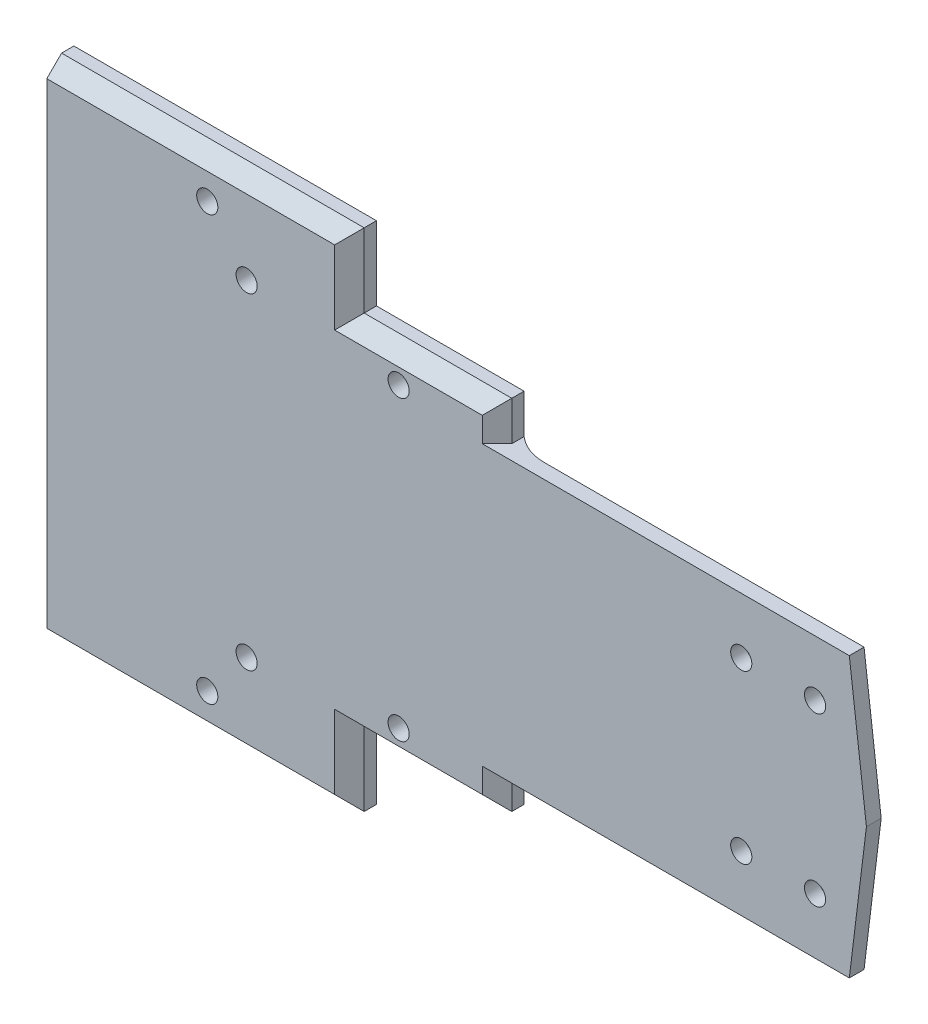
ISO-10303-21;
HEADER;
FILE_DESCRIPTION(('STEP AP214'),'2;1');
FILE_NAME('part.step','',(''),(''),'','','');
FILE_SCHEMA(('AUTOMOTIVE_DESIGN { 1 0 10303 214 1 1 1 1 }'));
ENDSEC;
DATA;
#1=APPLICATION_CONTEXT('core data for automotive mechanical design processes');
#2=APPLICATION_PROTOCOL_DEFINITION('international standard','automotive_design',2000,#1);
#3=PRODUCT_CONTEXT('',#1,'mechanical');
#4=PRODUCT('Part','Part','',(#3));
#5=PRODUCT_RELATED_PRODUCT_CATEGORY('part','',(#4));
#6=PRODUCT_DEFINITION_FORMATION('','',#4);
#7=PRODUCT_DEFINITION_CONTEXT('part definition',#1,'design');
#8=PRODUCT_DEFINITION('design','',#6,#7);
#9=PRODUCT_DEFINITION_SHAPE('','',#8);
#10=(LENGTH_UNIT() NAMED_UNIT(*) SI_UNIT(.MILLI.,.METRE.));
#11=(NAMED_UNIT(*) PLANE_ANGLE_UNIT() SI_UNIT($,.RADIAN.));
#12=(NAMED_UNIT(*) SI_UNIT($,.STERADIAN.) SOLID_ANGLE_UNIT());
#13=UNCERTAINTY_MEASURE_WITH_UNIT(LENGTH_MEASURE(1.E-05),#10,'distance_accuracy_value','');
#14=(GEOMETRIC_REPRESENTATION_CONTEXT(3) GLOBAL_UNCERTAINTY_ASSIGNED_CONTEXT((#13)) GLOBAL_UNIT_ASSIGNED_CONTEXT((#10,
#11,#12)) REPRESENTATION_CONTEXT('',''));
#15=CARTESIAN_POINT('',(0.,0.,0.));
#16=DIRECTION('',(0.,0.,1.));
#17=DIRECTION('',(1.,0.,0.));
#18=AXIS2_PLACEMENT_3D('',#15,#16,#17);
#19=CARTESIAN_POINT('',(-3.82500000000006,0.,-2.5));
#20=DIRECTION('',(-1.,0.,0.));
#21=DIRECTION('',(0.,-1.,0.));
#22=AXIS2_PLACEMENT_3D('',#19,#20,#21);
#23=PLANE('',#22);
#24=DIRECTION('',(0.,0.,1.));
#25=VECTOR('',#24,1.);
#26=CARTESIAN_POINT('',(-3.82500000000005,-28.37,3.));
#27=LINE('',#26,#25);
#28=CARTESIAN_POINT('',(-3.82500000000005,-28.37,-2.5));
#29=VERTEX_POINT('',#28);
#30=CARTESIAN_POINT('',(-3.82500000000005,-28.37,0.));
#31=VERTEX_POINT('',#30);
#32=EDGE_CURVE('E287',#29,#31,#27,.T.);
#33=ORIENTED_EDGE('',*,*,#32,.T.);
#34=DIRECTION('',(0.,-1.,0.));
#35=VECTOR('',#34,1.);
#36=CARTESIAN_POINT('',(-3.82500000000005,-36.37,0.));
#37=LINE('',#36,#35);
#38=CARTESIAN_POINT('',(-3.82500000000005,-36.37,0.));
#39=VERTEX_POINT('',#38);
#40=EDGE_CURVE('E329',#31,#39,#37,.T.);
#41=ORIENTED_EDGE('',*,*,#40,.T.);
#42=DIRECTION('',(0.,0.,1.));
#43=VECTOR('',#42,1.);
#44=CARTESIAN_POINT('',(-3.82500000000005,-36.37,-2.5));
#45=LINE('',#44,#43);
#46=CARTESIAN_POINT('',(-3.82500000000005,-36.37,-2.5));
#47=VERTEX_POINT('',#46);
#48=EDGE_CURVE('E257',#47,#39,#45,.T.);
#49=ORIENTED_EDGE('',*,*,#48,.F.);
#50=DIRECTION('',(0.,-1.,0.));
#51=VECTOR('',#50,1.);
#52=CARTESIAN_POINT('',(-3.82500000000006,0.,-2.5));
#53=LINE('',#52,#51);
#54=EDGE_CURVE('E247',#29,#47,#53,.T.);
#55=ORIENTED_EDGE('',*,*,#54,.F.);
#56=EDGE_LOOP('',(#33,#41,#49,#55));
#57=FACE_BOUND('',#56,.T.);
#58=ADVANCED_FACE('F38',(#57),#23,.F.);
#59=CARTESIAN_POINT('',(-71.2500000000001,28.37,3.));
#60=DIRECTION('',(0.,-1.,0.));
#61=DIRECTION('',(0.,0.,-1.));
#62=AXIS2_PLACEMENT_3D('',#59,#60,#61);
#63=PLANE('',#62);
#64=DIRECTION('',(0.,0.,-1.));
#65=VECTOR('',#64,1.);
#66=CARTESIAN_POINT('',(-3.82500000000005,28.37,3.));
#67=LINE('',#66,#65);
#68=CARTESIAN_POINT('',(-3.82500000000005,28.37,0.));
#69=VERTEX_POINT('',#68);
#70=CARTESIAN_POINT('',(-3.82500000000006,28.37,-2.5));
#71=VERTEX_POINT('',#70);
#72=EDGE_CURVE('E259',#69,#71,#67,.T.);
#73=ORIENTED_EDGE('',*,*,#72,.F.);
#74=DIRECTION('',(-0.707106781186544,0.,0.707106781186551));
#75=VECTOR('',#74,1.);
#76=CARTESIAN_POINT('',(-39.0374999999998,28.37,35.2125));
#77=LINE('',#76,#75);
#78=CARTESIAN_POINT('',(-6.82500000000007,28.37,3.));
#79=VERTEX_POINT('',#78);
#80=EDGE_CURVE('E48',#69,#79,#77,.T.);
#81=ORIENTED_EDGE('',*,*,#80,.T.);
#82=DIRECTION('',(-1.,0.,0.));
#83=VECTOR('',#82,1.);
#84=CARTESIAN_POINT('',(-71.2500000000001,28.37,3.));
#85=LINE('',#84,#83);
#86=CARTESIAN_POINT('',(67.7716280476557,28.37,3.));
#87=VERTEX_POINT('',#86);
#88=EDGE_CURVE('E282',#87,#79,#85,.T.);
#89=ORIENTED_EDGE('',*,*,#88,.F.);
#90=DIRECTION('',(0.,0.,1.));
#91=VECTOR('',#90,1.);
#92=CARTESIAN_POINT('',(67.7716280476557,28.37,0.));
#93=LINE('',#92,#91);
#94=CARTESIAN_POINT('',(67.7716280476557,28.37,0.));
#95=VERTEX_POINT('',#94);
#96=EDGE_CURVE('E278',#95,#87,#93,.T.);
#97=ORIENTED_EDGE('',*,*,#96,.F.);
#98=DIRECTION('',(-1.,0.,0.));
#99=VECTOR('',#98,1.);
#100=CARTESIAN_POINT('',(-71.2500000000001,28.37,0.));
#101=LINE('',#100,#99);
#102=CARTESIAN_POINT('',(2.78937827766142,28.37,0.));
#103=VERTEX_POINT('',#102);
#104=EDGE_CURVE('E280',#95,#103,#101,.T.);
#105=ORIENTED_EDGE('',*,*,#104,.T.);
#106=CARTESIAN_POINT('',(2.78937827766141,28.37,-10.));
#107=DIRECTION('',(0.,-1.,0.));
#108=DIRECTION('',(0.,0.,-1.));
#109=AXIS2_PLACEMENT_3D('',#106,#107,#108);
#110=CIRCLE('',#109,10.);
#111=EDGE_CURVE('E297',#103,#71,#110,.T.);
#112=ORIENTED_EDGE('',*,*,#111,.T.);
#113=EDGE_LOOP('',(#73,#81,#89,#97,#105,#112));
#114=FACE_BOUND('',#113,.T.);
#115=ADVANCED_FACE('F410',(#114),#63,.F.);
#116=CARTESIAN_POINT('',(0.,0.,0.));
#117=DIRECTION('',(0.,0.,1.));
#118=DIRECTION('',(1.,0.,0.));
#119=AXIS2_PLACEMENT_3D('',#116,#117,#118);
#120=PLANE('',#119);
#121=CARTESIAN_POINT('',(60.8080278919349,-17.,0.));
#122=DIRECTION('',(0.,0.,1.));
#123=DIRECTION('',(1.,0.,0.));
#124=AXIS2_PLACEMENT_3D('',#121,#122,#123);
#125=CIRCLE('',#124,2.15);
#126=CARTESIAN_POINT('',(62.9580278919349,-17.,0.));
#127=VERTEX_POINT('',#126);
#128=EDGE_CURVE('E244',#127,#127,#125,.T.);
#129=ORIENTED_EDGE('',*,*,#128,.T.);
#130=EDGE_LOOP('',(#129));
#131=FACE_BOUND('',#130,.T.);
#132=CARTESIAN_POINT('',(45.8080278919349,17.,0.));
#133=DIRECTION('',(0.,0.,1.));
#134=DIRECTION('',(1.,0.,0.));
#135=AXIS2_PLACEMENT_3D('',#132,#133,#134);
#136=CIRCLE('',#135,2.15);
#137=CARTESIAN_POINT('',(47.9580278919349,17.,0.));
#138=VERTEX_POINT('',#137);
#139=EDGE_CURVE('E241',#138,#138,#136,.T.);
#140=ORIENTED_EDGE('',*,*,#139,.T.);
#141=EDGE_LOOP('',(#140));
#142=FACE_BOUND('',#141,.T.);
#143=CARTESIAN_POINT('',(45.8080278919349,-17.,0.));
#144=DIRECTION('',(0.,0.,1.));
#145=DIRECTION('',(1.,0.,0.));
#146=AXIS2_PLACEMENT_3D('',#143,#144,#145);
#147=CIRCLE('',#146,2.15);
#148=CARTESIAN_POINT('',(47.9580278919349,-17.,0.));
#149=VERTEX_POINT('',#148);
#150=EDGE_CURVE('E238',#149,#149,#147,.T.);
#151=ORIENTED_EDGE('',*,*,#150,.T.);
#152=EDGE_LOOP('',(#151));
#153=FACE_BOUND('',#152,.T.);
#154=CARTESIAN_POINT('',(60.8080278919349,17.,0.));
#155=DIRECTION('',(0.,0.,1.));
#156=DIRECTION('',(1.,0.,0.));
#157=AXIS2_PLACEMENT_3D('',#154,#155,#156);
#158=CIRCLE('',#157,2.15);
#159=CARTESIAN_POINT('',(62.9580278919349,17.,0.));
#160=VERTEX_POINT('',#159);
#161=EDGE_CURVE('E235',#160,#160,#158,.T.);
#162=ORIENTED_EDGE('',*,*,#161,.T.);
#163=EDGE_LOOP('',(#162));
#164=FACE_BOUND('',#163,.T.);
#165=DIRECTION('',(1.,0.,0.));
#166=VECTOR('',#165,1.);
#167=CARTESIAN_POINT('',(-71.2500000000001,-28.37,0.));
#168=LINE('',#167,#166);
#169=CARTESIAN_POINT('',(2.78937827766143,-28.37,0.));
#170=VERTEX_POINT('',#169);
#171=CARTESIAN_POINT('',(67.7716280476557,-28.37,0.));
#172=VERTEX_POINT('',#171);
#173=EDGE_CURVE('E285',#170,#172,#168,.T.);
#174=ORIENTED_EDGE('',*,*,#173,.F.);
#175=DIRECTION('',(0.,1.,0.));
#176=VECTOR('',#175,1.);
#177=CARTESIAN_POINT('',(2.78937827766142,0.,0.));
#178=LINE('',#177,#176);
#179=EDGE_CURVE('E293',#170,#103,#178,.T.);
#180=ORIENTED_EDGE('',*,*,#179,.T.);
#181=ORIENTED_EDGE('',*,*,#104,.F.);
#182=DIRECTION('',(-0.121696109566606,0.992567406736869,0.));
#183=VECTOR('',#182,1.);
#184=CARTESIAN_POINT('',(70.1947915552901,8.60640092162754,0.));
#185=LINE('',#184,#183);
#186=CARTESIAN_POINT('',(71.25,0.,0.));
#187=VERTEX_POINT('',#186);
#188=EDGE_CURVE('E273',#187,#95,#185,.T.);
#189=ORIENTED_EDGE('',*,*,#188,.F.);
#190=DIRECTION('',(-0.121696109566606,-0.992567406736869,0.));
#191=VECTOR('',#190,1.);
#192=CARTESIAN_POINT('',(70.1947915552901,-8.60640092162754,0.));
#193=LINE('',#192,#191);
#194=EDGE_CURVE('E264',#187,#172,#193,.T.);
#195=ORIENTED_EDGE('',*,*,#194,.T.);
#196=EDGE_LOOP('',(#174,#180,#181,#189,#195));
#197=FACE_BOUND('',#196,.T.);
#198=ADVANCED_FACE('F416',(#131,#142,#153,#164,#197),#120,.F.);
#199=CARTESIAN_POINT('',(-71.2500000000001,-28.37,3.));
#200=DIRECTION('',(0.,1.,0.));
#201=DIRECTION('',(0.,0.,1.));
#202=AXIS2_PLACEMENT_3D('',#199,#200,#201);
#203=PLANE('',#202);
#204=ORIENTED_EDGE('',*,*,#32,.F.);
#205=CARTESIAN_POINT('',(2.78937827766142,-28.37,-10.));
#206=DIRECTION('',(0.,1.,0.));
#207=DIRECTION('',(0.,0.,1.));
#208=AXIS2_PLACEMENT_3D('',#205,#206,#207);
#209=CIRCLE('',#208,10.);
#210=EDGE_CURVE('E295',#29,#170,#209,.T.);
#211=ORIENTED_EDGE('',*,*,#210,.T.);
#212=ORIENTED_EDGE('',*,*,#173,.T.);
#213=DIRECTION('',(0.,0.,1.));
#214=VECTOR('',#213,1.);
#215=CARTESIAN_POINT('',(67.7716280476557,-28.37,0.));
#216=LINE('',#215,#214);
#217=CARTESIAN_POINT('',(67.7716280476557,-28.37,3.));
#218=VERTEX_POINT('',#217);
#219=EDGE_CURVE('E267',#172,#218,#216,.T.);
#220=ORIENTED_EDGE('',*,*,#219,.T.);
#221=DIRECTION('',(1.,0.,0.));
#222=VECTOR('',#221,1.);
#223=CARTESIAN_POINT('',(-71.2500000000001,-28.37,3.));
#224=LINE('',#223,#222);
#225=CARTESIAN_POINT('',(-6.82500000000008,-28.37,3.));
#226=VERTEX_POINT('',#225);
#227=EDGE_CURVE('E284',#226,#218,#224,.T.);
#228=ORIENTED_EDGE('',*,*,#227,.F.);
#229=DIRECTION('',(0.707106781186544,0.,-0.707106781186551));
#230=VECTOR('',#229,1.);
#231=CARTESIAN_POINT('',(-39.0374999999998,-28.37,35.2125));
#232=LINE('',#231,#230);
#233=EDGE_CURVE('E12',#226,#31,#232,.T.);
#234=ORIENTED_EDGE('',*,*,#233,.T.);
#235=EDGE_LOOP('',(#204,#211,#212,#220,#228,#234));
#236=FACE_BOUND('',#235,.T.);
#237=ADVANCED_FACE('F447',(#236),#203,.F.);
#238=CARTESIAN_POINT('',(0.,0.,3.));
#239=DIRECTION('',(0.,0.,1.));
#240=DIRECTION('',(1.,0.,0.));
#241=AXIS2_PLACEMENT_3D('',#238,#239,#240);
#242=PLANE('',#241);
#243=CARTESIAN_POINT('',(-62.7148909597241,43.0799892870198,3.));
#244=DIRECTION('',(0.,0.,-1.));
#245=DIRECTION('',(1.,0.,0.));
#246=AXIS2_PLACEMENT_3D('',#243,#244,#245);
#247=CIRCLE('',#246,2.15);
#248=CARTESIAN_POINT('',(-60.5648909597241,43.0799892870198,3.));
#249=VERTEX_POINT('',#248);
#250=EDGE_CURVE('E745',#249,#249,#247,.T.);
#251=ORIENTED_EDGE('',*,*,#250,.T.);
#252=EDGE_LOOP('',(#251));
#253=FACE_BOUND('',#252,.T.);
#254=CARTESIAN_POINT('',(-54.7148910187509,33.1839247215164,3.));
#255=DIRECTION('',(0.,0.,-1.));
#256=DIRECTION('',(1.,0.,0.));
#257=AXIS2_PLACEMENT_3D('',#254,#255,#256);
#258=CIRCLE('',#257,2.15);
#259=CARTESIAN_POINT('',(-52.5648910187509,33.1839247215164,3.));
#260=VERTEX_POINT('',#259);
#261=EDGE_CURVE('E754',#260,#260,#258,.T.);
#262=ORIENTED_EDGE('',*,*,#261,.T.);
#263=EDGE_LOOP('',(#262));
#264=FACE_BOUND('',#263,.T.);
#265=CARTESIAN_POINT('',(-23.8213770748601,30.1967158750513,3.));
#266=DIRECTION('',(0.,0.,-1.));
#267=DIRECTION('',(1.,0.,0.));
#268=AXIS2_PLACEMENT_3D('',#265,#266,#267);
#269=CIRCLE('',#268,2.15);
#270=CARTESIAN_POINT('',(-21.6713770748601,30.1967158750513,3.));
#271=VERTEX_POINT('',#270);
#272=EDGE_CURVE('E760',#271,#271,#269,.T.);
#273=ORIENTED_EDGE('',*,*,#272,.T.);
#274=EDGE_LOOP('',(#273));
#275=FACE_BOUND('',#274,.T.);
#276=CARTESIAN_POINT('',(-62.7148909597241,-43.0799892870198,3.));
#277=DIRECTION('',(0.,0.,1.));
#278=DIRECTION('',(1.,0.,0.));
#279=AXIS2_PLACEMENT_3D('',#276,#277,#278);
#280=CIRCLE('',#279,2.15);
#281=CARTESIAN_POINT('',(-60.5648909597241,-43.0799892870198,3.));
#282=VERTEX_POINT('',#281);
#283=EDGE_CURVE('E765',#282,#282,#280,.T.);
#284=ORIENTED_EDGE('',*,*,#283,.F.);
#285=EDGE_LOOP('',(#284));
#286=FACE_BOUND('',#285,.T.);
#287=CARTESIAN_POINT('',(-54.7148910187509,-33.1839247215164,3.));
#288=DIRECTION('',(0.,0.,1.));
#289=DIRECTION('',(1.,0.,0.));
#290=AXIS2_PLACEMENT_3D('',#287,#288,#289);
#291=CIRCLE('',#290,2.15);
#292=CARTESIAN_POINT('',(-52.5648910187509,-33.1839247215164,3.));
#293=VERTEX_POINT('',#292);
#294=EDGE_CURVE('E744',#293,#293,#291,.T.);
#295=ORIENTED_EDGE('',*,*,#294,.F.);
#296=EDGE_LOOP('',(#295));
#297=FACE_BOUND('',#296,.T.);
#298=CARTESIAN_POINT('',(-23.8213770748601,-30.1967158750513,3.));
#299=DIRECTION('',(0.,0.,1.));
#300=DIRECTION('',(1.,0.,0.));
#301=AXIS2_PLACEMENT_3D('',#298,#299,#300);
#302=CIRCLE('',#301,2.15);
#303=CARTESIAN_POINT('',(-21.6713770748601,-30.1967158750513,3.));
#304=VERTEX_POINT('',#303);
#305=EDGE_CURVE('E206',#304,#304,#302,.T.);
#306=ORIENTED_EDGE('',*,*,#305,.F.);
#307=EDGE_LOOP('',(#306));
#308=FACE_BOUND('',#307,.T.);
#309=ORIENTED_EDGE('',*,*,#88,.T.);
#310=DIRECTION('',(0.,1.,0.));
#311=VECTOR('',#310,1.);
#312=CARTESIAN_POINT('',(-6.82500000000007,36.37,3.));
#313=LINE('',#312,#311);
#314=CARTESIAN_POINT('',(-6.82500000000007,33.37,3.));
#315=VERTEX_POINT('',#314);
#316=EDGE_CURVE('E318',#79,#315,#313,.T.);
#317=ORIENTED_EDGE('',*,*,#316,.T.);
#318=DIRECTION('',(-1.,0.,0.));
#319=VECTOR('',#318,1.);
#320=CARTESIAN_POINT('',(-33.8250000000001,33.37,3.));
#321=LINE('',#320,#319);
#322=CARTESIAN_POINT('',(-36.8250000000001,33.37,3.));
#323=VERTEX_POINT('',#322);
#324=EDGE_CURVE('E316',#315,#323,#321,.T.);
#325=ORIENTED_EDGE('',*,*,#324,.T.);
#326=DIRECTION('',(0.,1.,0.));
#327=VECTOR('',#326,1.);
#328=CARTESIAN_POINT('',(-36.8250000000001,0.,3.));
#329=LINE('',#328,#327);
#330=CARTESIAN_POINT('',(-36.8250000000001,48.37,3.));
#331=VERTEX_POINT('',#330);
#332=EDGE_CURVE('E314',#323,#331,#329,.T.);
#333=ORIENTED_EDGE('',*,*,#332,.T.);
#334=DIRECTION('',(-1.,0.,0.));
#335=VECTOR('',#334,1.);
#336=CARTESIAN_POINT('',(0.,48.37,3.));
#337=LINE('',#336,#335);
#338=CARTESIAN_POINT('',(-95.3250000000001,48.37,3.));
#339=VERTEX_POINT('',#338);
#340=EDGE_CURVE('E312',#331,#339,#337,.T.);
#341=ORIENTED_EDGE('',*,*,#340,.T.);
#342=DIRECTION('',(0.,-1.,0.));
#343=VECTOR('',#342,1.);
#344=CARTESIAN_POINT('',(-95.3250000000001,51.37,3.));
#345=LINE('',#344,#343);
#346=CARTESIAN_POINT('',(-95.325,-48.37,3.));
#347=VERTEX_POINT('',#346);
#348=EDGE_CURVE('E200',#339,#347,#345,.T.);
#349=ORIENTED_EDGE('',*,*,#348,.T.);
#350=DIRECTION('',(1.,0.,0.));
#351=VECTOR('',#350,1.);
#352=CARTESIAN_POINT('',(0.,-48.37,3.));
#353=LINE('',#352,#351);
#354=CARTESIAN_POINT('',(-36.8250000000001,-48.37,3.));
#355=VERTEX_POINT('',#354);
#356=EDGE_CURVE('E303',#347,#355,#353,.T.);
#357=ORIENTED_EDGE('',*,*,#356,.T.);
#358=DIRECTION('',(0.,1.,0.));
#359=VECTOR('',#358,1.);
#360=CARTESIAN_POINT('',(-36.8250000000001,0.,3.));
#361=LINE('',#360,#359);
#362=CARTESIAN_POINT('',(-36.8250000000001,-33.37,3.));
#363=VERTEX_POINT('',#362);
#364=EDGE_CURVE('E305',#355,#363,#361,.T.);
#365=ORIENTED_EDGE('',*,*,#364,.T.);
#366=DIRECTION('',(1.,0.,0.));
#367=VECTOR('',#366,1.);
#368=CARTESIAN_POINT('',(0.,-33.37,3.));
#369=LINE('',#368,#367);
#370=CARTESIAN_POINT('',(-6.82500000000008,-33.37,3.));
#371=VERTEX_POINT('',#370);
#372=EDGE_CURVE('E307',#363,#371,#369,.T.);
#373=ORIENTED_EDGE('',*,*,#372,.T.);
#374=DIRECTION('',(0.,1.,0.));
#375=VECTOR('',#374,1.);
#376=CARTESIAN_POINT('',(-6.82500000000008,-28.37,3.));
#377=LINE('',#376,#375);
#378=EDGE_CURVE('E309',#371,#226,#377,.T.);
#379=ORIENTED_EDGE('',*,*,#378,.T.);
#380=ORIENTED_EDGE('',*,*,#227,.T.);
#381=DIRECTION('',(-0.121696109566606,-0.992567406736869,0.));
#382=VECTOR('',#381,1.);
#383=CARTESIAN_POINT('',(70.1947915552901,-8.60640092162754,3.));
#384=LINE('',#383,#382);
#385=CARTESIAN_POINT('',(71.25,0.,3.));
#386=VERTEX_POINT('',#385);
#387=EDGE_CURVE('E263',#386,#218,#384,.T.);
#388=ORIENTED_EDGE('',*,*,#387,.F.);
#389=DIRECTION('',(-0.121696109566606,0.992567406736869,0.));
#390=VECTOR('',#389,1.);
#391=CARTESIAN_POINT('',(70.1947915552901,8.60640092162754,3.));
#392=LINE('',#391,#390);
#393=EDGE_CURVE('E272',#386,#87,#392,.T.);
#394=ORIENTED_EDGE('',*,*,#393,.T.);
#395=EDGE_LOOP('',(#309,#317,#325,#333,#341,#349,#357,#365,#373,#379,#380,#388,#394));
#396=FACE_BOUND('',#395,.T.);
#397=CARTESIAN_POINT('',(60.8080278919349,-17.,3.));
#398=DIRECTION('',(0.,0.,1.));
#399=DIRECTION('',(1.,0.,0.));
#400=AXIS2_PLACEMENT_3D('',#397,#398,#399);
#401=CIRCLE('',#400,2.15);
#402=CARTESIAN_POINT('',(62.9580278919349,-17.,3.));
#403=VERTEX_POINT('',#402);
#404=EDGE_CURVE('E227',#403,#403,#401,.T.);
#405=ORIENTED_EDGE('',*,*,#404,.F.);
#406=EDGE_LOOP('',(#405));
#407=FACE_BOUND('',#406,.T.);
#408=CARTESIAN_POINT('',(45.8080278919349,17.,3.));
#409=DIRECTION('',(0.,0.,1.));
#410=DIRECTION('',(1.,0.,0.));
#411=AXIS2_PLACEMENT_3D('',#408,#409,#410);
#412=CIRCLE('',#411,2.15);
#413=CARTESIAN_POINT('',(47.9580278919349,17.,3.));
#414=VERTEX_POINT('',#413);
#415=EDGE_CURVE('E226',#414,#414,#412,.T.);
#416=ORIENTED_EDGE('',*,*,#415,.F.);
#417=EDGE_LOOP('',(#416));
#418=FACE_BOUND('',#417,.T.);
#419=CARTESIAN_POINT('',(45.8080278919349,-17.,3.));
#420=DIRECTION('',(0.,0.,1.));
#421=DIRECTION('',(1.,0.,0.));
#422=AXIS2_PLACEMENT_3D('',#419,#420,#421);
#423=CIRCLE('',#422,2.15);
#424=CARTESIAN_POINT('',(47.9580278919349,-17.,3.));
#425=VERTEX_POINT('',#424);
#426=EDGE_CURVE('E216',#425,#425,#423,.T.);
#427=ORIENTED_EDGE('',*,*,#426,.F.);
#428=EDGE_LOOP('',(#427));
#429=FACE_BOUND('',#428,.T.);
#430=CARTESIAN_POINT('',(60.8080278919349,17.,3.));
#431=DIRECTION('',(0.,0.,1.));
#432=DIRECTION('',(1.,0.,0.));
#433=AXIS2_PLACEMENT_3D('',#430,#431,#432);
#434=CIRCLE('',#433,2.15);
#435=CARTESIAN_POINT('',(62.9580278919349,17.,3.));
#436=VERTEX_POINT('',#435);
#437=EDGE_CURVE('E230',#436,#436,#434,.T.);
#438=ORIENTED_EDGE('',*,*,#437,.F.);
#439=EDGE_LOOP('',(#438));
#440=FACE_BOUND('',#439,.T.);
#441=ADVANCED_FACE('F452',(#253,#264,#275,#286,#297,#308,#396,#407,#418,#429,#440),#242,.T.);
#442=CARTESIAN_POINT('',(70.1947915552901,8.60640092162754,0.));
#443=DIRECTION('',(0.992567406736869,0.121696109566606,0.));
#444=DIRECTION('',(-0.121696109566606,0.992567406736869,0.));
#445=AXIS2_PLACEMENT_3D('',#442,#443,#444);
#446=PLANE('',#445);
#447=ORIENTED_EDGE('',*,*,#393,.F.);
#448=DIRECTION('',(0.,0.,1.));
#449=VECTOR('',#448,1.);
#450=CARTESIAN_POINT('',(71.25,0.,0.));
#451=LINE('',#450,#449);
#452=EDGE_CURVE('E275',#187,#386,#451,.T.);
#453=ORIENTED_EDGE('',*,*,#452,.F.);
#454=ORIENTED_EDGE('',*,*,#188,.T.);
#455=ORIENTED_EDGE('',*,*,#96,.T.);
#456=EDGE_LOOP('',(#447,#453,#454,#455));
#457=FACE_BOUND('',#456,.T.);
#458=ADVANCED_FACE('F428',(#457),#446,.T.);
#459=CARTESIAN_POINT('',(70.1947915552901,-8.60640092162754,0.));
#460=DIRECTION('',(-0.992567406736869,0.121696109566606,0.));
#461=DIRECTION('',(-0.121696109566606,-0.992567406736869,0.));
#462=AXIS2_PLACEMENT_3D('',#459,#460,#461);
#463=PLANE('',#462);
#464=ORIENTED_EDGE('',*,*,#387,.T.);
#465=ORIENTED_EDGE('',*,*,#219,.F.);
#466=ORIENTED_EDGE('',*,*,#194,.F.);
#467=ORIENTED_EDGE('',*,*,#452,.T.);
#468=EDGE_LOOP('',(#464,#465,#466,#467));
#469=FACE_BOUND('',#468,.T.);
#470=ADVANCED_FACE('F422',(#469),#463,.F.);
#471=DIRECTION('',(0.,0.,1.));
#472=VECTOR('',#471,1.);
#473=CARTESIAN_POINT('',(-3.82500000000006,36.37,-2.5));
#474=LINE('',#473,#472);
#475=CARTESIAN_POINT('',(-3.82500000000006,36.37,-2.5));
#476=VERTEX_POINT('',#475);
#477=CARTESIAN_POINT('',(-3.82500000000006,36.37,0.));
#478=VERTEX_POINT('',#477);
#479=EDGE_CURVE('E256',#476,#478,#474,.T.);
#480=ORIENTED_EDGE('',*,*,#479,.T.);
#481=DIRECTION('',(0.,-1.,0.));
#482=VECTOR('',#481,1.);
#483=CARTESIAN_POINT('',(-3.82500000000006,28.37,0.));
#484=LINE('',#483,#482);
#485=EDGE_CURVE('E300',#478,#69,#484,.T.);
#486=ORIENTED_EDGE('',*,*,#485,.T.);
#487=ORIENTED_EDGE('',*,*,#72,.T.);
#488=EDGE_CURVE('E248',#476,#71,#53,.T.);
#489=ORIENTED_EDGE('',*,*,#488,.F.);
#490=EDGE_LOOP('',(#480,#486,#487,#489));
#491=FACE_BOUND('',#490,.T.);
#492=ADVANCED_FACE('F412',(#491),#23,.F.);
#493=CARTESIAN_POINT('',(0.,-36.37,-2.5));
#494=DIRECTION('',(0.,-1.,0.));
#495=DIRECTION('',(0.,0.,-1.));
#496=AXIS2_PLACEMENT_3D('',#493,#494,#495);
#497=PLANE('',#496);
#498=ORIENTED_EDGE('',*,*,#48,.T.);
#499=DIRECTION('',(-1.,0.,0.));
#500=VECTOR('',#499,1.);
#501=CARTESIAN_POINT('',(0.,-36.37,0.));
#502=LINE('',#501,#500);
#503=CARTESIAN_POINT('',(-33.8250000000001,-36.37,0.));
#504=VERTEX_POINT('',#503);
#505=EDGE_CURVE('E64',#39,#504,#502,.T.);
#506=ORIENTED_EDGE('',*,*,#505,.T.);
#507=DIRECTION('',(0.,0.,1.));
#508=VECTOR('',#507,1.);
#509=CARTESIAN_POINT('',(-33.8250000000001,-36.37,-2.5));
#510=LINE('',#509,#508);
#511=CARTESIAN_POINT('',(-33.8250000000001,-36.37,-2.5));
#512=VERTEX_POINT('',#511);
#513=EDGE_CURVE('E214',#512,#504,#510,.T.);
#514=ORIENTED_EDGE('',*,*,#513,.F.);
#515=DIRECTION('',(1.,0.,0.));
#516=VECTOR('',#515,1.);
#517=CARTESIAN_POINT('',(0.,-36.37,-2.5));
#518=LINE('',#517,#516);
#519=EDGE_CURVE('E254',#512,#47,#518,.T.);
#520=ORIENTED_EDGE('',*,*,#519,.T.);
#521=EDGE_LOOP('',(#498,#506,#514,#520));
#522=FACE_BOUND('',#521,.T.);
#523=ADVANCED_FACE('F395',(#522),#497,.T.);
#524=CARTESIAN_POINT('',(0.,36.37,-2.5));
#525=DIRECTION('',(0.,-1.,0.));
#526=DIRECTION('',(0.,0.,-1.));
#527=AXIS2_PLACEMENT_3D('',#524,#525,#526);
#528=PLANE('',#527);
#529=DIRECTION('',(0.,0.,1.));
#530=VECTOR('',#529,1.);
#531=CARTESIAN_POINT('',(-33.8250000000001,36.37,-2.5));
#532=LINE('',#531,#530);
#533=CARTESIAN_POINT('',(-33.8250000000001,36.37,-2.5));
#534=VERTEX_POINT('',#533);
#535=CARTESIAN_POINT('',(-33.8250000000001,36.37,0.));
#536=VERTEX_POINT('',#535);
#537=EDGE_CURVE('E185',#534,#536,#532,.T.);
#538=ORIENTED_EDGE('',*,*,#537,.T.);
#539=DIRECTION('',(1.,0.,0.));
#540=VECTOR('',#539,1.);
#541=CARTESIAN_POINT('',(-3.82500000000006,36.37,0.));
#542=LINE('',#541,#540);
#543=EDGE_CURVE('E320',#536,#478,#542,.T.);
#544=ORIENTED_EDGE('',*,*,#543,.T.);
#545=ORIENTED_EDGE('',*,*,#479,.F.);
#546=DIRECTION('',(1.,0.,0.));
#547=VECTOR('',#546,1.);
#548=CARTESIAN_POINT('',(0.,36.37,-2.5));
#549=LINE('',#548,#547);
#550=EDGE_CURVE('E251',#534,#476,#549,.T.);
#551=ORIENTED_EDGE('',*,*,#550,.F.);
#552=EDGE_LOOP('',(#538,#544,#545,#551));
#553=FACE_BOUND('',#552,.T.);
#554=ADVANCED_FACE('F378',(#553),#528,.F.);
#555=CARTESIAN_POINT('',(0.,0.,-2.5));
#556=DIRECTION('',(0.,0.,1.));
#557=DIRECTION('',(1.,0.,0.));
#558=AXIS2_PLACEMENT_3D('',#555,#556,#557);
#559=PLANE('',#558);
#560=CARTESIAN_POINT('',(-62.7148909597241,43.0799892870198,-2.5));
#561=DIRECTION('',(0.,0.,-1.));
#562=DIRECTION('',(1.,0.,0.));
#563=AXIS2_PLACEMENT_3D('',#560,#561,#562);
#564=CIRCLE('',#563,2.15);
#565=CARTESIAN_POINT('',(-60.5648909597241,43.0799892870198,-2.5));
#566=VERTEX_POINT('',#565);
#567=EDGE_CURVE('E743',#566,#566,#564,.T.);
#568=ORIENTED_EDGE('',*,*,#567,.F.);
#569=EDGE_LOOP('',(#568));
#570=FACE_BOUND('',#569,.T.);
#571=CARTESIAN_POINT('',(-54.7148910187509,33.1839247215164,-2.5));
#572=DIRECTION('',(0.,0.,-1.));
#573=DIRECTION('',(1.,0.,0.));
#574=AXIS2_PLACEMENT_3D('',#571,#572,#573);
#575=CIRCLE('',#574,2.15);
#576=CARTESIAN_POINT('',(-52.5648910187509,33.1839247215164,-2.5));
#577=VERTEX_POINT('',#576);
#578=EDGE_CURVE('E749',#577,#577,#575,.T.);
#579=ORIENTED_EDGE('',*,*,#578,.F.);
#580=EDGE_LOOP('',(#579));
#581=FACE_BOUND('',#580,.T.);
#582=CARTESIAN_POINT('',(-23.8213770748601,30.1967158750513,-2.5));
#583=DIRECTION('',(0.,0.,-1.));
#584=DIRECTION('',(1.,0.,0.));
#585=AXIS2_PLACEMENT_3D('',#582,#583,#584);
#586=CIRCLE('',#585,2.15);
#587=CARTESIAN_POINT('',(-21.6713770748601,30.1967158750513,-2.5));
#588=VERTEX_POINT('',#587);
#589=EDGE_CURVE('E757',#588,#588,#586,.T.);
#590=ORIENTED_EDGE('',*,*,#589,.F.);
#591=EDGE_LOOP('',(#590));
#592=FACE_BOUND('',#591,.T.);
#593=CARTESIAN_POINT('',(-62.7148909597241,-43.0799892870198,-2.5));
#594=DIRECTION('',(0.,0.,1.));
#595=DIRECTION('',(1.,0.,0.));
#596=AXIS2_PLACEMENT_3D('',#593,#594,#595);
#597=CIRCLE('',#596,2.15);
#598=CARTESIAN_POINT('',(-60.5648909597241,-43.0799892870198,-2.5));
#599=VERTEX_POINT('',#598);
#600=EDGE_CURVE('E348',#599,#599,#597,.T.);
#601=ORIENTED_EDGE('',*,*,#600,.T.);
#602=EDGE_LOOP('',(#601));
#603=FACE_BOUND('',#602,.T.);
#604=CARTESIAN_POINT('',(-54.7148910187509,-33.1839247215164,-2.5));
#605=DIRECTION('',(0.,0.,1.));
#606=DIRECTION('',(1.,0.,0.));
#607=AXIS2_PLACEMENT_3D('',#604,#605,#606);
#608=CIRCLE('',#607,2.15);
#609=CARTESIAN_POINT('',(-52.5648910187509,-33.1839247215164,-2.5));
#610=VERTEX_POINT('',#609);
#611=EDGE_CURVE('E768',#610,#610,#608,.T.);
#612=ORIENTED_EDGE('',*,*,#611,.T.);
#613=EDGE_LOOP('',(#612));
#614=FACE_BOUND('',#613,.T.);
#615=CARTESIAN_POINT('',(-23.8213770748601,-30.1967158750513,-2.5));
#616=DIRECTION('',(0.,0.,1.));
#617=DIRECTION('',(1.,0.,0.));
#618=AXIS2_PLACEMENT_3D('',#615,#616,#617);
#619=CIRCLE('',#618,2.15);
#620=CARTESIAN_POINT('',(-21.6713770748601,-30.1967158750513,-2.5));
#621=VERTEX_POINT('',#620);
#622=EDGE_CURVE('E739',#621,#621,#619,.T.);
#623=ORIENTED_EDGE('',*,*,#622,.T.);
#624=EDGE_LOOP('',(#623));
#625=FACE_BOUND('',#624,.T.);
#626=ORIENTED_EDGE('',*,*,#519,.F.);
#627=DIRECTION('',(0.,1.,0.));
#628=VECTOR('',#627,1.);
#629=CARTESIAN_POINT('',(-33.8250000000001,-36.37,-2.5));
#630=LINE('',#629,#628);
#631=CARTESIAN_POINT('',(-33.8250000000001,-51.37,-2.5));
#632=VERTEX_POINT('',#631);
#633=EDGE_CURVE('E212',#632,#512,#630,.T.);
#634=ORIENTED_EDGE('',*,*,#633,.F.);
#635=DIRECTION('',(1.,0.,0.));
#636=VECTOR('',#635,1.);
#637=CARTESIAN_POINT('',(-68.8250000000001,-51.37,-2.5));
#638=LINE('',#637,#636);
#639=CARTESIAN_POINT('',(-95.325,-51.37,-2.5));
#640=VERTEX_POINT('',#639);
#641=EDGE_CURVE('E210',#640,#632,#638,.T.);
#642=ORIENTED_EDGE('',*,*,#641,.F.);
#643=DIRECTION('',(0.,-1.,0.));
#644=VECTOR('',#643,1.);
#645=CARTESIAN_POINT('',(-95.3250000000001,51.37,-2.5));
#646=LINE('',#645,#644);
#647=CARTESIAN_POINT('',(-95.3250000000001,51.37,-2.5));
#648=VERTEX_POINT('',#647);
#649=EDGE_CURVE('E195',#648,#640,#646,.T.);
#650=ORIENTED_EDGE('',*,*,#649,.F.);
#651=DIRECTION('',(-1.,0.,0.));
#652=VECTOR('',#651,1.);
#653=CARTESIAN_POINT('',(-68.8250000000001,51.37,-2.5));
#654=LINE('',#653,#652);
#655=CARTESIAN_POINT('',(-33.8250000000001,51.37,-2.5));
#656=VERTEX_POINT('',#655);
#657=EDGE_CURVE('E177',#656,#648,#654,.T.);
#658=ORIENTED_EDGE('',*,*,#657,.F.);
#659=DIRECTION('',(0.,1.,0.));
#660=VECTOR('',#659,1.);
#661=CARTESIAN_POINT('',(-33.8250000000001,36.37,-2.5));
#662=LINE('',#661,#660);
#663=EDGE_CURVE('E191',#534,#656,#662,.T.);
#664=ORIENTED_EDGE('',*,*,#663,.F.);
#665=ORIENTED_EDGE('',*,*,#550,.T.);
#666=ORIENTED_EDGE('',*,*,#488,.T.);
#667=EDGE_CURVE('E252',#71,#29,#53,.T.);
#668=ORIENTED_EDGE('',*,*,#667,.T.);
#669=ORIENTED_EDGE('',*,*,#54,.T.);
#670=EDGE_LOOP('',(#626,#634,#642,#650,#658,#664,#665,#666,#668,#669));
#671=FACE_BOUND('',#670,.T.);
#672=ADVANCED_FACE('F190',(#570,#581,#592,#603,#614,#625,#671),#559,.F.);
#673=CARTESIAN_POINT('',(2.78937827766142,0.,-10.));
#674=DIRECTION('',(0.,1.,0.));
#675=DIRECTION('',(-1.,0.,0.));
#676=AXIS2_PLACEMENT_3D('',#673,#674,#675);
#677=CYLINDRICAL_SURFACE('',#676,10.);
#678=ORIENTED_EDGE('',*,*,#111,.F.);
#679=ORIENTED_EDGE('',*,*,#179,.F.);
#680=ORIENTED_EDGE('',*,*,#210,.F.);
#681=ORIENTED_EDGE('',*,*,#667,.F.);
#682=EDGE_LOOP('',(#678,#679,#680,#681));
#683=FACE_BOUND('',#682,.T.);
#684=ADVANCED_FACE('F388',(#683),#677,.F.);
#685=CARTESIAN_POINT('',(60.8080278919349,17.,-2.5));
#686=DIRECTION('',(0.,0.,1.));
#687=DIRECTION('',(1.,0.,0.));
#688=AXIS2_PLACEMENT_3D('',#685,#686,#687);
#689=CYLINDRICAL_SURFACE('',#688,2.15);
#690=ORIENTED_EDGE('',*,*,#437,.T.);
#691=EDGE_LOOP('',(#690));
#692=FACE_BOUND('',#691,.T.);
#693=ORIENTED_EDGE('',*,*,#161,.F.);
#694=EDGE_LOOP('',(#693));
#695=FACE_BOUND('',#694,.T.);
#696=ADVANCED_FACE('F470',(#692,#695),#689,.F.);
#697=CARTESIAN_POINT('',(45.8080278919349,-17.,-2.5));
#698=DIRECTION('',(0.,0.,1.));
#699=DIRECTION('',(1.,0.,0.));
#700=AXIS2_PLACEMENT_3D('',#697,#698,#699);
#701=CYLINDRICAL_SURFACE('',#700,2.15);
#702=ORIENTED_EDGE('',*,*,#426,.T.);
#703=EDGE_LOOP('',(#702));
#704=FACE_BOUND('',#703,.T.);
#705=ORIENTED_EDGE('',*,*,#150,.F.);
#706=EDGE_LOOP('',(#705));
#707=FACE_BOUND('',#706,.T.);
#708=ADVANCED_FACE('F616',(#704,#707),#701,.F.);
#709=CARTESIAN_POINT('',(45.8080278919349,17.,-2.5));
#710=DIRECTION('',(0.,0.,1.));
#711=DIRECTION('',(1.,0.,0.));
#712=AXIS2_PLACEMENT_3D('',#709,#710,#711);
#713=CYLINDRICAL_SURFACE('',#712,2.15);
#714=ORIENTED_EDGE('',*,*,#415,.T.);
#715=EDGE_LOOP('',(#714));
#716=FACE_BOUND('',#715,.T.);
#717=ORIENTED_EDGE('',*,*,#139,.F.);
#718=EDGE_LOOP('',(#717));
#719=FACE_BOUND('',#718,.T.);
#720=ADVANCED_FACE('F405',(#716,#719),#713,.F.);
#721=CARTESIAN_POINT('',(60.8080278919349,-17.,-2.5));
#722=DIRECTION('',(0.,0.,1.));
#723=DIRECTION('',(1.,0.,0.));
#724=AXIS2_PLACEMENT_3D('',#721,#722,#723);
#725=CYLINDRICAL_SURFACE('',#724,2.15);
#726=ORIENTED_EDGE('',*,*,#404,.T.);
#727=EDGE_LOOP('',(#726));
#728=FACE_BOUND('',#727,.T.);
#729=ORIENTED_EDGE('',*,*,#128,.F.);
#730=EDGE_LOOP('',(#729));
#731=FACE_BOUND('',#730,.T.);
#732=ADVANCED_FACE('F398',(#728,#731),#725,.F.);
#733=CARTESIAN_POINT('',(-33.8250000000001,-36.37,-2.5));
#734=DIRECTION('',(1.,0.,0.));
#735=DIRECTION('',(0.,0.,-1.));
#736=AXIS2_PLACEMENT_3D('',#733,#734,#735);
#737=PLANE('',#736);
#738=ORIENTED_EDGE('',*,*,#513,.T.);
#739=DIRECTION('',(0.,-1.,0.));
#740=VECTOR('',#739,1.);
#741=CARTESIAN_POINT('',(-33.8250000000001,-36.37,0.));
#742=LINE('',#741,#740);
#743=CARTESIAN_POINT('',(-33.8250000000001,-51.37,0.));
#744=VERTEX_POINT('',#743);
#745=EDGE_CURVE('E56',#504,#744,#742,.T.);
#746=ORIENTED_EDGE('',*,*,#745,.T.);
#747=DIRECTION('',(0.,0.,1.));
#748=VECTOR('',#747,1.);
#749=CARTESIAN_POINT('',(-33.8250000000001,-51.37,-2.5));
#750=LINE('',#749,#748);
#751=EDGE_CURVE('E217',#632,#744,#750,.T.);
#752=ORIENTED_EDGE('',*,*,#751,.F.);
#753=ORIENTED_EDGE('',*,*,#633,.T.);
#754=EDGE_LOOP('',(#738,#746,#752,#753));
#755=FACE_BOUND('',#754,.T.);
#756=ADVANCED_FACE('F396',(#755),#737,.T.);
#757=CARTESIAN_POINT('',(-68.8250000000001,-51.37,-2.5));
#758=DIRECTION('',(0.,-1.,0.));
#759=DIRECTION('',(0.,0.,-1.));
#760=AXIS2_PLACEMENT_3D('',#757,#758,#759);
#761=PLANE('',#760);
#762=ORIENTED_EDGE('',*,*,#751,.T.);
#763=DIRECTION('',(-1.,0.,0.));
#764=VECTOR('',#763,1.);
#765=CARTESIAN_POINT('',(-68.8250000000001,-51.37,0.));
#766=LINE('',#765,#764);
#767=CARTESIAN_POINT('',(-95.325,-51.37,0.));
#768=VERTEX_POINT('',#767);
#769=EDGE_CURVE('E334',#744,#768,#766,.T.);
#770=ORIENTED_EDGE('',*,*,#769,.T.);
#771=DIRECTION('',(0.,0.,1.));
#772=VECTOR('',#771,1.);
#773=CARTESIAN_POINT('',(-95.325,-51.37,-2.5));
#774=LINE('',#773,#772);
#775=EDGE_CURVE('E219',#640,#768,#774,.T.);
#776=ORIENTED_EDGE('',*,*,#775,.F.);
#777=ORIENTED_EDGE('',*,*,#641,.T.);
#778=EDGE_LOOP('',(#762,#770,#776,#777));
#779=FACE_BOUND('',#778,.T.);
#780=ADVANCED_FACE('F363',(#779),#761,.T.);
#781=CARTESIAN_POINT('',(-95.3250000000001,51.37,-2.5));
#782=DIRECTION('',(-1.,0.,0.));
#783=DIRECTION('',(0.,-1.,0.));
#784=AXIS2_PLACEMENT_3D('',#781,#782,#783);
#785=PLANE('',#784);
#786=ORIENTED_EDGE('',*,*,#348,.F.);
#787=DIRECTION('',(0.,-0.707106781186544,0.707106781186551));
#788=VECTOR('',#787,1.);
#789=CARTESIAN_POINT('',(-95.3250000000001,52.62,-1.25000000000003));
#790=LINE('',#789,#788);
#791=CARTESIAN_POINT('',(-95.3250000000001,51.37,0.));
#792=VERTEX_POINT('',#791);
#793=EDGE_CURVE('E326',#339,#792,#790,.F.);
#794=ORIENTED_EDGE('',*,*,#793,.T.);
#795=DIRECTION('',(0.,0.,1.));
#796=VECTOR('',#795,1.);
#797=CARTESIAN_POINT('',(-95.3250000000001,51.37,-2.5));
#798=LINE('',#797,#796);
#799=EDGE_CURVE('E184',#648,#792,#798,.T.);
#800=ORIENTED_EDGE('',*,*,#799,.F.);
#801=ORIENTED_EDGE('',*,*,#649,.T.);
#802=ORIENTED_EDGE('',*,*,#775,.T.);
#803=DIRECTION('',(0.,-0.707106781186544,-0.707106781186551));
#804=VECTOR('',#803,1.);
#805=CARTESIAN_POINT('',(-95.325,-1.25000000000045,50.12));
#806=LINE('',#805,#804);
#807=EDGE_CURVE('E324',#768,#347,#806,.F.);
#808=ORIENTED_EDGE('',*,*,#807,.T.);
#809=EDGE_LOOP('',(#786,#794,#800,#801,#802,#808));
#810=FACE_BOUND('',#809,.T.);
#811=ADVANCED_FACE('F366',(#810),#785,.T.);
#812=CARTESIAN_POINT('',(-68.8250000000001,51.37,-2.5));
#813=DIRECTION('',(0.,1.,0.));
#814=DIRECTION('',(-1.,0.,0.));
#815=AXIS2_PLACEMENT_3D('',#812,#813,#814);
#816=PLANE('',#815);
#817=ORIENTED_EDGE('',*,*,#799,.T.);
#818=DIRECTION('',(1.,0.,0.));
#819=VECTOR('',#818,1.);
#820=CARTESIAN_POINT('',(-68.8250000000001,51.37,0.));
#821=LINE('',#820,#819);
#822=CARTESIAN_POINT('',(-33.8250000000001,51.37,0.));
#823=VERTEX_POINT('',#822);
#824=EDGE_CURVE('E180',#792,#823,#821,.T.);
#825=ORIENTED_EDGE('',*,*,#824,.T.);
#826=DIRECTION('',(0.,0.,1.));
#827=VECTOR('',#826,1.);
#828=CARTESIAN_POINT('',(-33.8250000000001,51.37,-2.5));
#829=LINE('',#828,#827);
#830=EDGE_CURVE('E173',#656,#823,#829,.T.);
#831=ORIENTED_EDGE('',*,*,#830,.F.);
#832=ORIENTED_EDGE('',*,*,#657,.T.);
#833=EDGE_LOOP('',(#817,#825,#831,#832));
#834=FACE_BOUND('',#833,.T.);
#835=ADVANCED_FACE('F176',(#834),#816,.T.);
#836=CARTESIAN_POINT('',(-33.8250000000001,36.37,-2.5));
#837=DIRECTION('',(1.,0.,0.));
#838=DIRECTION('',(0.,0.,-1.));
#839=AXIS2_PLACEMENT_3D('',#836,#837,#838);
#840=PLANE('',#839);
#841=ORIENTED_EDGE('',*,*,#830,.T.);
#842=DIRECTION('',(0.,-1.,0.));
#843=VECTOR('',#842,1.);
#844=CARTESIAN_POINT('',(-33.8250000000001,36.37,0.));
#845=LINE('',#844,#843);
#846=EDGE_CURVE('E322',#823,#536,#845,.T.);
#847=ORIENTED_EDGE('',*,*,#846,.T.);
#848=ORIENTED_EDGE('',*,*,#537,.F.);
#849=ORIENTED_EDGE('',*,*,#663,.T.);
#850=EDGE_LOOP('',(#841,#847,#848,#849));
#851=FACE_BOUND('',#850,.T.);
#852=ADVANCED_FACE('F197',(#851),#840,.T.);
#853=CARTESIAN_POINT('',(0.,48.37,3.));
#854=DIRECTION('',(0.,-0.707106781186551,-0.707106781186544));
#855=DIRECTION('',(-1.,0.,0.));
#856=AXIS2_PLACEMENT_3D('',#853,#854,#855);
#857=PLANE('',#856);
#858=ORIENTED_EDGE('',*,*,#793,.F.);
#859=ORIENTED_EDGE('',*,*,#340,.F.);
#860=DIRECTION('',(0.577350269189624,0.577350269189624,-0.57735026918963));
#861=VECTOR('',#860,1.);
#862=CARTESIAN_POINT('',(-24.5500000000001,60.645,-9.27500000000006));
#863=LINE('',#862,#861);
#864=EDGE_CURVE('E203',#823,#331,#863,.F.);
#865=ORIENTED_EDGE('',*,*,#864,.F.);
#866=ORIENTED_EDGE('',*,*,#824,.F.);
#867=EDGE_LOOP('',(#858,#859,#865,#866));
#868=FACE_BOUND('',#867,.T.);
#869=ADVANCED_FACE('F369',(#868),#857,.F.);
#870=CARTESIAN_POINT('',(-36.8250000000001,0.,3.));
#871=DIRECTION('',(-0.707106781186551,0.,-0.707106781186544));
#872=DIRECTION('',(0.,1.,0.));
#873=AXIS2_PLACEMENT_3D('',#870,#871,#872);
#874=PLANE('',#873);
#875=ORIENTED_EDGE('',*,*,#864,.T.);
#876=ORIENTED_EDGE('',*,*,#332,.F.);
#877=DIRECTION('',(-0.577350269189624,-0.577350269189624,0.577350269189629));
#878=VECTOR('',#877,1.);
#879=CARTESIAN_POINT('',(-22.5500000000001,47.645,-11.2750000000001));
#880=LINE('',#879,#878);
#881=EDGE_CURVE('E341',#536,#323,#880,.T.);
#882=ORIENTED_EDGE('',*,*,#881,.F.);
#883=ORIENTED_EDGE('',*,*,#846,.F.);
#884=EDGE_LOOP('',(#875,#876,#882,#883));
#885=FACE_BOUND('',#884,.T.);
#886=ADVANCED_FACE('F375',(#885),#874,.F.);
#887=CARTESIAN_POINT('',(0.,36.37,0.));
#888=DIRECTION('',(0.,0.707106781186551,0.707106781186544));
#889=DIRECTION('',(-1.,0.,0.));
#890=AXIS2_PLACEMENT_3D('',#887,#888,#889);
#891=PLANE('',#890);
#892=ORIENTED_EDGE('',*,*,#881,.T.);
#893=ORIENTED_EDGE('',*,*,#324,.F.);
#894=DIRECTION('',(0.577350269189624,0.577350269189624,-0.577350269189629));
#895=VECTOR('',#894,1.);
#896=CARTESIAN_POINT('',(-2.55000000000005,37.645,-1.27500000000006));
#897=LINE('',#896,#895);
#898=EDGE_CURVE('E338',#478,#315,#897,.F.);
#899=ORIENTED_EDGE('',*,*,#898,.F.);
#900=ORIENTED_EDGE('',*,*,#543,.F.);
#901=EDGE_LOOP('',(#892,#893,#899,#900));
#902=FACE_BOUND('',#901,.T.);
#903=ADVANCED_FACE('F435',(#902),#891,.T.);
#904=CARTESIAN_POINT('',(-3.82500000000006,0.,0.));
#905=DIRECTION('',(0.707106781186551,0.,0.707106781186544));
#906=DIRECTION('',(0.,1.,0.));
#907=AXIS2_PLACEMENT_3D('',#904,#905,#906);
#908=PLANE('',#907);
#909=ORIENTED_EDGE('',*,*,#898,.T.);
#910=ORIENTED_EDGE('',*,*,#316,.F.);
#911=ORIENTED_EDGE('',*,*,#80,.F.);
#912=ORIENTED_EDGE('',*,*,#485,.F.);
#913=EDGE_LOOP('',(#909,#910,#911,#912));
#914=FACE_BOUND('',#913,.T.);
#915=ADVANCED_FACE('F438',(#914),#908,.T.);
#916=CARTESIAN_POINT('',(0.,-48.37,3.));
#917=DIRECTION('',(0.,0.707106781186551,-0.707106781186544));
#918=DIRECTION('',(1.,0.,0.));
#919=AXIS2_PLACEMENT_3D('',#916,#917,#918);
#920=PLANE('',#919);
#921=ORIENTED_EDGE('',*,*,#807,.F.);
#922=ORIENTED_EDGE('',*,*,#769,.F.);
#923=DIRECTION('',(-0.577350269189624,0.577350269189624,0.577350269189629));
#924=VECTOR('',#923,1.);
#925=CARTESIAN_POINT('',(-24.5500000000001,-60.6449999999999,-9.27500000000006));
#926=LINE('',#925,#924);
#927=EDGE_CURVE('E43',#355,#744,#926,.F.);
#928=ORIENTED_EDGE('',*,*,#927,.F.);
#929=ORIENTED_EDGE('',*,*,#356,.F.);
#930=EDGE_LOOP('',(#921,#922,#928,#929));
#931=FACE_BOUND('',#930,.T.);
#932=ADVANCED_FACE('F41',(#931),#920,.F.);
#933=CARTESIAN_POINT('',(-36.8250000000001,0.,3.));
#934=DIRECTION('',(-0.707106781186551,0.,-0.707106781186544));
#935=DIRECTION('',(0.,1.,0.));
#936=AXIS2_PLACEMENT_3D('',#933,#934,#935);
#937=PLANE('',#936);
#938=ORIENTED_EDGE('',*,*,#927,.T.);
#939=ORIENTED_EDGE('',*,*,#745,.F.);
#940=DIRECTION('',(-0.577350269189624,0.577350269189624,0.577350269189629));
#941=VECTOR('',#940,1.);
#942=CARTESIAN_POINT('',(-24.5500000000001,-45.6449999999999,-9.27500000000006));
#943=LINE('',#942,#941);
#944=EDGE_CURVE('E347',#363,#504,#943,.F.);
#945=ORIENTED_EDGE('',*,*,#944,.F.);
#946=ORIENTED_EDGE('',*,*,#364,.F.);
#947=EDGE_LOOP('',(#938,#939,#945,#946));
#948=FACE_BOUND('',#947,.T.);
#949=ADVANCED_FACE('F357',(#948),#937,.F.);
#950=CARTESIAN_POINT('',(0.,-33.37,3.));
#951=DIRECTION('',(0.,0.707106781186551,-0.707106781186544));
#952=DIRECTION('',(1.,0.,0.));
#953=AXIS2_PLACEMENT_3D('',#950,#951,#952);
#954=PLANE('',#953);
#955=ORIENTED_EDGE('',*,*,#944,.T.);
#956=ORIENTED_EDGE('',*,*,#505,.F.);
#957=DIRECTION('',(0.577350269189624,-0.577350269189624,-0.577350269189629));
#958=VECTOR('',#957,1.);
#959=CARTESIAN_POINT('',(-4.55000000000007,-35.645,0.724999999999966));
#960=LINE('',#959,#958);
#961=EDGE_CURVE('E346',#371,#39,#960,.T.);
#962=ORIENTED_EDGE('',*,*,#961,.F.);
#963=ORIENTED_EDGE('',*,*,#372,.F.);
#964=EDGE_LOOP('',(#955,#956,#962,#963));
#965=FACE_BOUND('',#964,.T.);
#966=ADVANCED_FACE('F499',(#965),#954,.F.);
#967=CARTESIAN_POINT('',(-3.82500000000006,0.,0.));
#968=DIRECTION('',(0.707106781186551,0.,0.707106781186544));
#969=DIRECTION('',(0.,1.,0.));
#970=AXIS2_PLACEMENT_3D('',#967,#968,#969);
#971=PLANE('',#970);
#972=ORIENTED_EDGE('',*,*,#233,.F.);
#973=ORIENTED_EDGE('',*,*,#378,.F.);
#974=ORIENTED_EDGE('',*,*,#961,.T.);
#975=ORIENTED_EDGE('',*,*,#40,.F.);
#976=EDGE_LOOP('',(#972,#973,#974,#975));
#977=FACE_BOUND('',#976,.T.);
#978=ADVANCED_FACE('F492',(#977),#971,.T.);
#979=CARTESIAN_POINT('',(-23.8213770748601,-30.1967158750513,-2.5));
#980=DIRECTION('',(0.,0.,1.));
#981=DIRECTION('',(1.,0.,0.));
#982=AXIS2_PLACEMENT_3D('',#979,#980,#981);
#983=CYLINDRICAL_SURFACE('',#982,2.15);
#984=ORIENTED_EDGE('',*,*,#622,.F.);
#985=EDGE_LOOP('',(#984));
#986=FACE_BOUND('',#985,.T.);
#987=ORIENTED_EDGE('',*,*,#305,.T.);
#988=EDGE_LOOP('',(#987));
#989=FACE_BOUND('',#988,.T.);
#990=ADVANCED_FACE('F498',(#986,#989),#983,.F.);
#991=CARTESIAN_POINT('',(-54.7148910187509,-33.1839247215164,-2.5));
#992=DIRECTION('',(0.,0.,1.));
#993=DIRECTION('',(1.,0.,0.));
#994=AXIS2_PLACEMENT_3D('',#991,#992,#993);
#995=CYLINDRICAL_SURFACE('',#994,2.15);
#996=ORIENTED_EDGE('',*,*,#611,.F.);
#997=EDGE_LOOP('',(#996));
#998=FACE_BOUND('',#997,.T.);
#999=ORIENTED_EDGE('',*,*,#294,.T.);
#1000=EDGE_LOOP('',(#999));
#1001=FACE_BOUND('',#1000,.T.);
#1002=ADVANCED_FACE('F728',(#998,#1001),#995,.F.);
#1003=CARTESIAN_POINT('',(-62.7148909597241,-43.0799892870198,-2.5));
#1004=DIRECTION('',(0.,0.,1.));
#1005=DIRECTION('',(1.,0.,0.));
#1006=AXIS2_PLACEMENT_3D('',#1003,#1004,#1005);
#1007=CYLINDRICAL_SURFACE('',#1006,2.15);
#1008=ORIENTED_EDGE('',*,*,#600,.F.);
#1009=EDGE_LOOP('',(#1008));
#1010=FACE_BOUND('',#1009,.T.);
#1011=ORIENTED_EDGE('',*,*,#283,.T.);
#1012=EDGE_LOOP('',(#1011));
#1013=FACE_BOUND('',#1012,.T.);
#1014=ADVANCED_FACE('F698',(#1010,#1013),#1007,.F.);
#1015=CARTESIAN_POINT('',(-23.8213770748601,30.1967158750513,-2.5));
#1016=DIRECTION('',(0.,0.,1.));
#1017=DIRECTION('',(1.,0.,0.));
#1018=AXIS2_PLACEMENT_3D('',#1015,#1016,#1017);
#1019=CYLINDRICAL_SURFACE('',#1018,2.15);
#1020=ORIENTED_EDGE('',*,*,#589,.T.);
#1021=EDGE_LOOP('',(#1020));
#1022=FACE_BOUND('',#1021,.T.);
#1023=ORIENTED_EDGE('',*,*,#272,.F.);
#1024=EDGE_LOOP('',(#1023));
#1025=FACE_BOUND('',#1024,.T.);
#1026=ADVANCED_FACE('F692',(#1022,#1025),#1019,.F.);
#1027=CARTESIAN_POINT('',(-54.7148910187509,33.1839247215164,-2.5));
#1028=DIRECTION('',(0.,0.,1.));
#1029=DIRECTION('',(1.,0.,0.));
#1030=AXIS2_PLACEMENT_3D('',#1027,#1028,#1029);
#1031=CYLINDRICAL_SURFACE('',#1030,2.15);
#1032=ORIENTED_EDGE('',*,*,#578,.T.);
#1033=EDGE_LOOP('',(#1032));
#1034=FACE_BOUND('',#1033,.T.);
#1035=ORIENTED_EDGE('',*,*,#261,.F.);
#1036=EDGE_LOOP('',(#1035));
#1037=FACE_BOUND('',#1036,.T.);
#1038=ADVANCED_FACE('F697',(#1034,#1037),#1031,.F.);
#1039=CARTESIAN_POINT('',(-62.7148909597241,43.0799892870198,-2.5));
#1040=DIRECTION('',(0.,0.,1.));
#1041=DIRECTION('',(1.,0.,0.));
#1042=AXIS2_PLACEMENT_3D('',#1039,#1040,#1041);
#1043=CYLINDRICAL_SURFACE('',#1042,2.15);
#1044=ORIENTED_EDGE('',*,*,#567,.T.);
#1045=EDGE_LOOP('',(#1044));
#1046=FACE_BOUND('',#1045,.T.);
#1047=ORIENTED_EDGE('',*,*,#250,.F.);
#1048=EDGE_LOOP('',(#1047));
#1049=FACE_BOUND('',#1048,.T.);
#1050=ADVANCED_FACE('F710',(#1046,#1049),#1043,.F.);
#1051=CLOSED_SHELL('',(#58,#115,#198,#237,#441,#458,#470,#492,#523,#554,#672,#684,#696,#708,
#720,#732,#756,#780,#811,#835,#852,#869,#886,#903,#915,#932,#949,#966,#978,#990,#1002,#1014,
#1026,#1038,#1050));
#1052=MANIFOLD_SOLID_BREP('B2',#1051);
#1053=ADVANCED_BREP_SHAPE_REPRESENTATION('',(#18,#1052),#14);
#1054=SHAPE_DEFINITION_REPRESENTATION(#9,#1053);
ENDSEC;
END-ISO-10303-21;
